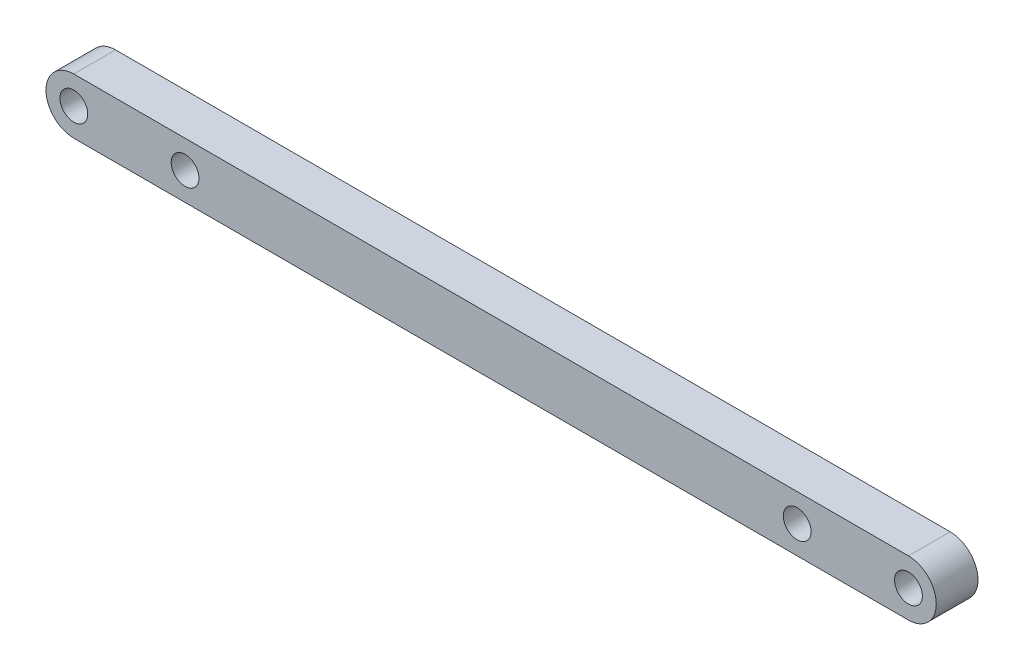
ISO-10303-21;
HEADER;
FILE_DESCRIPTION(('STEP AP214'),'2;1');
FILE_NAME('part.step','',(''),(''),'','','');
FILE_SCHEMA(('AUTOMOTIVE_DESIGN { 1 0 10303 214 1 1 1 1 }'));
ENDSEC;
DATA;
#1=APPLICATION_CONTEXT('core data for automotive mechanical design processes');
#2=APPLICATION_PROTOCOL_DEFINITION('international standard','automotive_design',2000,#1);
#3=PRODUCT_CONTEXT('',#1,'mechanical');
#4=PRODUCT('Part','Part','',(#3));
#5=PRODUCT_RELATED_PRODUCT_CATEGORY('part','',(#4));
#6=PRODUCT_DEFINITION_FORMATION('','',#4);
#7=PRODUCT_DEFINITION_CONTEXT('part definition',#1,'design');
#8=PRODUCT_DEFINITION('design','',#6,#7);
#9=PRODUCT_DEFINITION_SHAPE('','',#8);
#10=(LENGTH_UNIT() NAMED_UNIT(*) SI_UNIT(.MILLI.,.METRE.));
#11=(NAMED_UNIT(*) PLANE_ANGLE_UNIT() SI_UNIT($,.RADIAN.));
#12=(NAMED_UNIT(*) SI_UNIT($,.STERADIAN.) SOLID_ANGLE_UNIT());
#13=UNCERTAINTY_MEASURE_WITH_UNIT(LENGTH_MEASURE(1.E-05),#10,'distance_accuracy_value','');
#14=(GEOMETRIC_REPRESENTATION_CONTEXT(3) GLOBAL_UNCERTAINTY_ASSIGNED_CONTEXT((#13)) GLOBAL_UNIT_ASSIGNED_CONTEXT((#10,
#11,#12)) REPRESENTATION_CONTEXT('',''));
#15=CARTESIAN_POINT('',(0.,0.,0.));
#16=DIRECTION('',(0.,0.,1.));
#17=DIRECTION('',(1.,0.,0.));
#18=AXIS2_PLACEMENT_3D('',#15,#16,#17);
#19=CARTESIAN_POINT('',(0.,0.,3.));
#20=DIRECTION('',(0.,0.,1.));
#21=DIRECTION('',(1.,0.,0.));
#22=AXIS2_PLACEMENT_3D('',#19,#20,#21);
#23=PLANE('',#22);
#24=CARTESIAN_POINT('',(52.,0.,3.));
#25=DIRECTION('',(0.,0.,1.));
#26=DIRECTION('',(-1.,0.,0.));
#27=AXIS2_PLACEMENT_3D('',#24,#25,#26);
#28=CIRCLE('',#27,1.);
#29=CARTESIAN_POINT('',(51.,0.,3.));
#30=VERTEX_POINT('',#29);
#31=EDGE_CURVE('E125',#30,#30,#28,.T.);
#32=ORIENTED_EDGE('',*,*,#31,.F.);
#33=EDGE_LOOP('',(#32));
#34=FACE_BOUND('',#33,.T.);
#35=CARTESIAN_POINT('',(0.,0.,3.));
#36=DIRECTION('',(0.,0.,1.));
#37=DIRECTION('',(1.,0.,0.));
#38=AXIS2_PLACEMENT_3D('',#35,#36,#37);
#39=CIRCLE('',#38,1.);
#40=CARTESIAN_POINT('',(1.,0.,3.));
#41=VERTEX_POINT('',#40);
#42=EDGE_CURVE('E104',#41,#41,#39,.T.);
#43=ORIENTED_EDGE('',*,*,#42,.F.);
#44=EDGE_LOOP('',(#43));
#45=FACE_BOUND('',#44,.T.);
#46=CARTESIAN_POINT('',(0.,0.,3.));
#47=DIRECTION('',(0.,0.,1.));
#48=DIRECTION('',(1.,0.,0.));
#49=AXIS2_PLACEMENT_3D('',#46,#47,#48);
#50=CIRCLE('',#49,2.);
#51=CARTESIAN_POINT('',(0.,2.,3.));
#52=VERTEX_POINT('',#51);
#53=CARTESIAN_POINT('',(0.,-2.,3.));
#54=VERTEX_POINT('',#53);
#55=EDGE_CURVE('E89',#52,#54,#50,.T.);
#56=ORIENTED_EDGE('',*,*,#55,.T.);
#57=DIRECTION('',(1.,0.,0.));
#58=VECTOR('',#57,1.);
#59=CARTESIAN_POINT('',(0.,-2.,3.));
#60=LINE('',#59,#58);
#61=CARTESIAN_POINT('',(60.,-2.,3.));
#62=VERTEX_POINT('',#61);
#63=EDGE_CURVE('E84',#54,#62,#60,.T.);
#64=ORIENTED_EDGE('',*,*,#63,.T.);
#65=CARTESIAN_POINT('',(60.,0.,3.));
#66=DIRECTION('',(0.,0.,1.));
#67=DIRECTION('',(1.,0.,0.));
#68=AXIS2_PLACEMENT_3D('',#65,#66,#67);
#69=CIRCLE('',#68,2.);
#70=CARTESIAN_POINT('',(60.,2.,3.));
#71=VERTEX_POINT('',#70);
#72=EDGE_CURVE('E87',#62,#71,#69,.T.);
#73=ORIENTED_EDGE('',*,*,#72,.T.);
#74=DIRECTION('',(-1.,0.,0.));
#75=VECTOR('',#74,1.);
#76=CARTESIAN_POINT('',(0.,2.,3.));
#77=LINE('',#76,#75);
#78=EDGE_CURVE('E54',#71,#52,#77,.T.);
#79=ORIENTED_EDGE('',*,*,#78,.T.);
#80=EDGE_LOOP('',(#56,#64,#73,#79));
#81=FACE_BOUND('',#80,.T.);
#82=CARTESIAN_POINT('',(8.,0.,3.));
#83=DIRECTION('',(0.,0.,1.));
#84=DIRECTION('',(1.,0.,0.));
#85=AXIS2_PLACEMENT_3D('',#82,#83,#84);
#86=CIRCLE('',#85,1.);
#87=CARTESIAN_POINT('',(9.,0.,3.));
#88=VERTEX_POINT('',#87);
#89=EDGE_CURVE('E119',#88,#88,#86,.T.);
#90=ORIENTED_EDGE('',*,*,#89,.F.);
#91=EDGE_LOOP('',(#90));
#92=FACE_BOUND('',#91,.T.);
#93=CARTESIAN_POINT('',(60.,0.,3.));
#94=DIRECTION('',(0.,0.,1.));
#95=DIRECTION('',(-1.,0.,0.));
#96=AXIS2_PLACEMENT_3D('',#93,#94,#95);
#97=CIRCLE('',#96,1.);
#98=CARTESIAN_POINT('',(59.,0.,3.));
#99=VERTEX_POINT('',#98);
#100=EDGE_CURVE('E131',#99,#99,#97,.T.);
#101=ORIENTED_EDGE('',*,*,#100,.F.);
#102=EDGE_LOOP('',(#101));
#103=FACE_BOUND('',#102,.T.);
#104=ADVANCED_FACE('F37',(#34,#45,#81,#92,#103),#23,.T.);
#105=CARTESIAN_POINT('',(0.,0.,0.));
#106=DIRECTION('',(0.,0.,1.));
#107=DIRECTION('',(1.,0.,0.));
#108=AXIS2_PLACEMENT_3D('',#105,#106,#107);
#109=PLANE('',#108);
#110=CARTESIAN_POINT('',(0.,0.,0.));
#111=DIRECTION('',(0.,0.,1.));
#112=DIRECTION('',(1.,0.,0.));
#113=AXIS2_PLACEMENT_3D('',#110,#111,#112);
#114=CIRCLE('',#113,2.);
#115=CARTESIAN_POINT('',(0.,2.,0.));
#116=VERTEX_POINT('',#115);
#117=CARTESIAN_POINT('',(0.,-2.,0.));
#118=VERTEX_POINT('',#117);
#119=EDGE_CURVE('E101',#116,#118,#114,.T.);
#120=ORIENTED_EDGE('',*,*,#119,.F.);
#121=DIRECTION('',(-1.,0.,0.));
#122=VECTOR('',#121,1.);
#123=CARTESIAN_POINT('',(0.,2.,0.));
#124=LINE('',#123,#122);
#125=CARTESIAN_POINT('',(60.,2.,0.));
#126=VERTEX_POINT('',#125);
#127=EDGE_CURVE('E77',#126,#116,#124,.T.);
#128=ORIENTED_EDGE('',*,*,#127,.F.);
#129=CARTESIAN_POINT('',(60.,0.,0.));
#130=DIRECTION('',(0.,0.,1.));
#131=DIRECTION('',(1.,0.,0.));
#132=AXIS2_PLACEMENT_3D('',#129,#130,#131);
#133=CIRCLE('',#132,2.);
#134=CARTESIAN_POINT('',(60.,-2.,0.));
#135=VERTEX_POINT('',#134);
#136=EDGE_CURVE('E71',#135,#126,#133,.T.);
#137=ORIENTED_EDGE('',*,*,#136,.F.);
#138=DIRECTION('',(1.,0.,0.));
#139=VECTOR('',#138,1.);
#140=CARTESIAN_POINT('',(0.,-2.,0.));
#141=LINE('',#140,#139);
#142=EDGE_CURVE('E93',#118,#135,#141,.T.);
#143=ORIENTED_EDGE('',*,*,#142,.F.);
#144=EDGE_LOOP('',(#120,#128,#137,#143));
#145=FACE_BOUND('',#144,.T.);
#146=CARTESIAN_POINT('',(0.,0.,0.));
#147=DIRECTION('',(0.,0.,1.));
#148=DIRECTION('',(1.,0.,0.));
#149=AXIS2_PLACEMENT_3D('',#146,#147,#148);
#150=CIRCLE('',#149,1.);
#151=CARTESIAN_POINT('',(1.,0.,0.));
#152=VERTEX_POINT('',#151);
#153=EDGE_CURVE('E116',#152,#152,#150,.T.);
#154=ORIENTED_EDGE('',*,*,#153,.T.);
#155=EDGE_LOOP('',(#154));
#156=FACE_BOUND('',#155,.T.);
#157=CARTESIAN_POINT('',(8.,0.,0.));
#158=DIRECTION('',(0.,0.,1.));
#159=DIRECTION('',(1.,0.,0.));
#160=AXIS2_PLACEMENT_3D('',#157,#158,#159);
#161=CIRCLE('',#160,1.);
#162=CARTESIAN_POINT('',(9.,0.,0.));
#163=VERTEX_POINT('',#162);
#164=EDGE_CURVE('E122',#163,#163,#161,.T.);
#165=ORIENTED_EDGE('',*,*,#164,.T.);
#166=EDGE_LOOP('',(#165));
#167=FACE_BOUND('',#166,.T.);
#168=CARTESIAN_POINT('',(52.,0.,0.));
#169=DIRECTION('',(0.,0.,1.));
#170=DIRECTION('',(-1.,0.,0.));
#171=AXIS2_PLACEMENT_3D('',#168,#169,#170);
#172=CIRCLE('',#171,1.);
#173=CARTESIAN_POINT('',(51.,0.,0.));
#174=VERTEX_POINT('',#173);
#175=EDGE_CURVE('E128',#174,#174,#172,.T.);
#176=ORIENTED_EDGE('',*,*,#175,.T.);
#177=EDGE_LOOP('',(#176));
#178=FACE_BOUND('',#177,.T.);
#179=CARTESIAN_POINT('',(60.,0.,0.));
#180=DIRECTION('',(0.,0.,1.));
#181=DIRECTION('',(-1.,0.,0.));
#182=AXIS2_PLACEMENT_3D('',#179,#180,#181);
#183=CIRCLE('',#182,1.);
#184=CARTESIAN_POINT('',(59.,0.,0.));
#185=VERTEX_POINT('',#184);
#186=EDGE_CURVE('E134',#185,#185,#183,.T.);
#187=ORIENTED_EDGE('',*,*,#186,.T.);
#188=EDGE_LOOP('',(#187));
#189=FACE_BOUND('',#188,.T.);
#190=ADVANCED_FACE('F112',(#145,#156,#167,#178,#189),#109,.F.);
#191=CARTESIAN_POINT('',(0.,0.,3.));
#192=DIRECTION('',(0.,0.,-1.));
#193=DIRECTION('',(-1.,0.,0.));
#194=AXIS2_PLACEMENT_3D('',#191,#192,#193);
#195=CYLINDRICAL_SURFACE('',#194,2.);
#196=ORIENTED_EDGE('',*,*,#119,.T.);
#197=DIRECTION('',(0.,0.,-1.));
#198=VECTOR('',#197,1.);
#199=CARTESIAN_POINT('',(0.,-2.,3.));
#200=LINE('',#199,#198);
#201=EDGE_CURVE('E11',#54,#118,#200,.T.);
#202=ORIENTED_EDGE('',*,*,#201,.F.);
#203=ORIENTED_EDGE('',*,*,#55,.F.);
#204=DIRECTION('',(0.,0.,-1.));
#205=VECTOR('',#204,1.);
#206=CARTESIAN_POINT('',(0.,2.,3.));
#207=LINE('',#206,#205);
#208=EDGE_CURVE('E97',#52,#116,#207,.T.);
#209=ORIENTED_EDGE('',*,*,#208,.T.);
#210=EDGE_LOOP('',(#196,#202,#203,#209));
#211=FACE_BOUND('',#210,.T.);
#212=ADVANCED_FACE('F39',(#211),#195,.T.);
#213=CARTESIAN_POINT('',(0.,-2.,3.));
#214=DIRECTION('',(0.,1.,0.));
#215=DIRECTION('',(0.,0.,1.));
#216=AXIS2_PLACEMENT_3D('',#213,#214,#215);
#217=PLANE('',#216);
#218=ORIENTED_EDGE('',*,*,#142,.T.);
#219=DIRECTION('',(0.,0.,-1.));
#220=VECTOR('',#219,1.);
#221=CARTESIAN_POINT('',(60.,-2.,3.));
#222=LINE('',#221,#220);
#223=EDGE_CURVE('E46',#62,#135,#222,.T.);
#224=ORIENTED_EDGE('',*,*,#223,.F.);
#225=ORIENTED_EDGE('',*,*,#63,.F.);
#226=ORIENTED_EDGE('',*,*,#201,.T.);
#227=EDGE_LOOP('',(#218,#224,#225,#226));
#228=FACE_BOUND('',#227,.T.);
#229=ADVANCED_FACE('F92',(#228),#217,.F.);
#230=CARTESIAN_POINT('',(60.,0.,3.));
#231=DIRECTION('',(0.,0.,-1.));
#232=DIRECTION('',(-1.,0.,0.));
#233=AXIS2_PLACEMENT_3D('',#230,#231,#232);
#234=CYLINDRICAL_SURFACE('',#233,2.);
#235=ORIENTED_EDGE('',*,*,#136,.T.);
#236=DIRECTION('',(0.,0.,-1.));
#237=VECTOR('',#236,1.);
#238=CARTESIAN_POINT('',(60.,2.,3.));
#239=LINE('',#238,#237);
#240=EDGE_CURVE('E94',#71,#126,#239,.T.);
#241=ORIENTED_EDGE('',*,*,#240,.F.);
#242=ORIENTED_EDGE('',*,*,#72,.F.);
#243=ORIENTED_EDGE('',*,*,#223,.T.);
#244=EDGE_LOOP('',(#235,#241,#242,#243));
#245=FACE_BOUND('',#244,.T.);
#246=ADVANCED_FACE('F95',(#245),#234,.T.);
#247=CARTESIAN_POINT('',(0.,2.,3.));
#248=DIRECTION('',(0.,-1.,0.));
#249=DIRECTION('',(0.,0.,-1.));
#250=AXIS2_PLACEMENT_3D('',#247,#248,#249);
#251=PLANE('',#250);
#252=ORIENTED_EDGE('',*,*,#127,.T.);
#253=ORIENTED_EDGE('',*,*,#208,.F.);
#254=ORIENTED_EDGE('',*,*,#78,.F.);
#255=ORIENTED_EDGE('',*,*,#240,.T.);
#256=EDGE_LOOP('',(#252,#253,#254,#255));
#257=FACE_BOUND('',#256,.T.);
#258=ADVANCED_FACE('F109',(#257),#251,.F.);
#259=CARTESIAN_POINT('',(0.,0.,3.));
#260=DIRECTION('',(0.,0.,-1.));
#261=DIRECTION('',(-1.,0.,0.));
#262=AXIS2_PLACEMENT_3D('',#259,#260,#261);
#263=CYLINDRICAL_SURFACE('',#262,1.);
#264=ORIENTED_EDGE('',*,*,#42,.T.);
#265=EDGE_LOOP('',(#264));
#266=FACE_BOUND('',#265,.T.);
#267=ORIENTED_EDGE('',*,*,#153,.F.);
#268=EDGE_LOOP('',(#267));
#269=FACE_BOUND('',#268,.T.);
#270=ADVANCED_FACE('F153',(#266,#269),#263,.F.);
#271=CARTESIAN_POINT('',(8.,0.,3.));
#272=DIRECTION('',(0.,0.,-1.));
#273=DIRECTION('',(-1.,0.,0.));
#274=AXIS2_PLACEMENT_3D('',#271,#272,#273);
#275=CYLINDRICAL_SURFACE('',#274,1.);
#276=ORIENTED_EDGE('',*,*,#89,.T.);
#277=EDGE_LOOP('',(#276));
#278=FACE_BOUND('',#277,.T.);
#279=ORIENTED_EDGE('',*,*,#164,.F.);
#280=EDGE_LOOP('',(#279));
#281=FACE_BOUND('',#280,.T.);
#282=ADVANCED_FACE('F207',(#278,#281),#275,.F.);
#283=CARTESIAN_POINT('',(52.,0.,3.));
#284=DIRECTION('',(0.,0.,-1.));
#285=DIRECTION('',(-1.,0.,0.));
#286=AXIS2_PLACEMENT_3D('',#283,#284,#285);
#287=CYLINDRICAL_SURFACE('',#286,1.);
#288=ORIENTED_EDGE('',*,*,#31,.T.);
#289=EDGE_LOOP('',(#288));
#290=FACE_BOUND('',#289,.T.);
#291=ORIENTED_EDGE('',*,*,#175,.F.);
#292=EDGE_LOOP('',(#291));
#293=FACE_BOUND('',#292,.T.);
#294=ADVANCED_FACE('F216',(#290,#293),#287,.F.);
#295=CARTESIAN_POINT('',(60.,0.,3.));
#296=DIRECTION('',(0.,0.,-1.));
#297=DIRECTION('',(-1.,0.,0.));
#298=AXIS2_PLACEMENT_3D('',#295,#296,#297);
#299=CYLINDRICAL_SURFACE('',#298,1.);
#300=ORIENTED_EDGE('',*,*,#100,.T.);
#301=EDGE_LOOP('',(#300));
#302=FACE_BOUND('',#301,.T.);
#303=ORIENTED_EDGE('',*,*,#186,.F.);
#304=EDGE_LOOP('',(#303));
#305=FACE_BOUND('',#304,.T.);
#306=ADVANCED_FACE('F140',(#302,#305),#299,.F.);
#307=CLOSED_SHELL('',(#104,#190,#212,#229,#246,#258,#270,#282,#294,#306));
#308=MANIFOLD_SOLID_BREP('B2',#307);
#309=ADVANCED_BREP_SHAPE_REPRESENTATION('',(#18,#308),#14);
#310=SHAPE_DEFINITION_REPRESENTATION(#9,#309);
ENDSEC;
END-ISO-10303-21;
